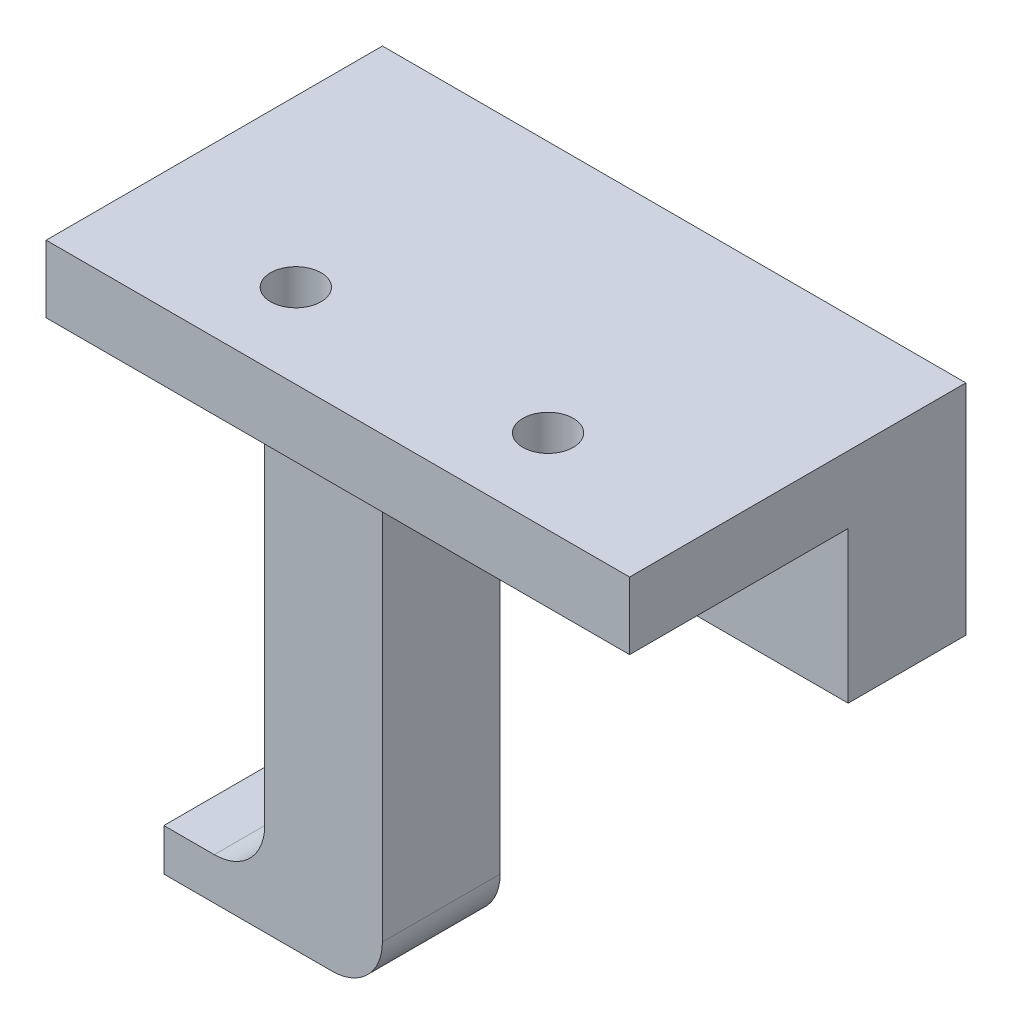
ISO-10303-21;
HEADER;
FILE_DESCRIPTION(('STEP AP214'),'2;1');
FILE_NAME('part.step','',(''),(''),'','','');
FILE_SCHEMA(('AUTOMOTIVE_DESIGN { 1 0 10303 214 1 1 1 1 }'));
ENDSEC;
DATA;
#1=APPLICATION_CONTEXT('core data for automotive mechanical design processes');
#2=APPLICATION_PROTOCOL_DEFINITION('international standard','automotive_design',2000,#1);
#3=PRODUCT_CONTEXT('',#1,'mechanical');
#4=PRODUCT('Part','Part','',(#3));
#5=PRODUCT_RELATED_PRODUCT_CATEGORY('part','',(#4));
#6=PRODUCT_DEFINITION_FORMATION('','',#4);
#7=PRODUCT_DEFINITION_CONTEXT('part definition',#1,'design');
#8=PRODUCT_DEFINITION('design','',#6,#7);
#9=PRODUCT_DEFINITION_SHAPE('','',#8);
#10=(LENGTH_UNIT() NAMED_UNIT(*) SI_UNIT(.MILLI.,.METRE.));
#11=(NAMED_UNIT(*) PLANE_ANGLE_UNIT() SI_UNIT($,.RADIAN.));
#12=(NAMED_UNIT(*) SI_UNIT($,.STERADIAN.) SOLID_ANGLE_UNIT());
#13=UNCERTAINTY_MEASURE_WITH_UNIT(LENGTH_MEASURE(1.E-05),#10,'distance_accuracy_value','');
#14=(GEOMETRIC_REPRESENTATION_CONTEXT(3) GLOBAL_UNCERTAINTY_ASSIGNED_CONTEXT((#13)) GLOBAL_UNIT_ASSIGNED_CONTEXT((#10,
#11,#12)) REPRESENTATION_CONTEXT('',''));
#15=CARTESIAN_POINT('',(0.,0.,0.));
#16=DIRECTION('',(0.,0.,1.));
#17=DIRECTION('',(1.,0.,0.));
#18=AXIS2_PLACEMENT_3D('',#15,#16,#17);
#19=CARTESIAN_POINT('',(0.,-26.65,7.));
#20=DIRECTION('',(0.,-1.,0.));
#21=DIRECTION('',(0.,0.,-1.));
#22=AXIS2_PLACEMENT_3D('',#19,#20,#21);
#23=PLANE('',#22);
#24=DIRECTION('',(-1.,0.,0.));
#25=VECTOR('',#24,1.);
#26=CARTESIAN_POINT('',(0.,-26.65,7.));
#27=LINE('',#26,#25);
#28=CARTESIAN_POINT('',(-3.,-26.65,7.));
#29=VERTEX_POINT('',#28);
#30=CARTESIAN_POINT('',(-6.,-26.65,7.));
#31=VERTEX_POINT('',#30);
#32=EDGE_CURVE('E179',#29,#31,#27,.T.);
#33=ORIENTED_EDGE('',*,*,#32,.F.);
#34=DIRECTION('',(0.,0.,-1.));
#35=VECTOR('',#34,1.);
#36=CARTESIAN_POINT('',(-3.,-26.65,0.));
#37=LINE('',#36,#35);
#38=CARTESIAN_POINT('',(-3.,-26.65,0.));
#39=VERTEX_POINT('',#38);
#40=EDGE_CURVE('E230',#29,#39,#37,.T.);
#41=ORIENTED_EDGE('',*,*,#40,.T.);
#42=DIRECTION('',(-1.,0.,0.));
#43=VECTOR('',#42,1.);
#44=CARTESIAN_POINT('',(0.,-26.65,0.));
#45=LINE('',#44,#43);
#46=CARTESIAN_POINT('',(-6.,-26.65,0.));
#47=VERTEX_POINT('',#46);
#48=EDGE_CURVE('E176',#39,#47,#45,.T.);
#49=ORIENTED_EDGE('',*,*,#48,.T.);
#50=DIRECTION('',(0.,0.,-1.));
#51=VECTOR('',#50,1.);
#52=CARTESIAN_POINT('',(-6.,-26.65,7.));
#53=LINE('',#52,#51);
#54=EDGE_CURVE('E213',#31,#47,#53,.T.);
#55=ORIENTED_EDGE('',*,*,#54,.F.);
#56=EDGE_LOOP('',(#33,#41,#49,#55));
#57=FACE_BOUND('',#56,.T.);
#58=ADVANCED_FACE('F33',(#57),#23,.F.);
#59=CARTESIAN_POINT('',(-6.,-29.15,7.));
#60=DIRECTION('',(1.,0.,0.));
#61=DIRECTION('',(0.,0.,-1.));
#62=AXIS2_PLACEMENT_3D('',#59,#60,#61);
#63=PLANE('',#62);
#64=DIRECTION('',(0.,-1.,0.));
#65=VECTOR('',#64,1.);
#66=CARTESIAN_POINT('',(-6.,-29.15,0.));
#67=LINE('',#66,#65);
#68=CARTESIAN_POINT('',(-6.,-29.15,0.));
#69=VERTEX_POINT('',#68);
#70=EDGE_CURVE('E198',#47,#69,#67,.T.);
#71=ORIENTED_EDGE('',*,*,#70,.T.);
#72=DIRECTION('',(0.,0.,-1.));
#73=VECTOR('',#72,1.);
#74=CARTESIAN_POINT('',(-6.,-29.15,7.));
#75=LINE('',#74,#73);
#76=CARTESIAN_POINT('',(-6.,-29.15,7.));
#77=VERTEX_POINT('',#76);
#78=EDGE_CURVE('E210',#77,#69,#75,.T.);
#79=ORIENTED_EDGE('',*,*,#78,.F.);
#80=DIRECTION('',(0.,-1.,0.));
#81=VECTOR('',#80,1.);
#82=CARTESIAN_POINT('',(-6.,-29.15,7.));
#83=LINE('',#82,#81);
#84=EDGE_CURVE('E181',#31,#77,#83,.T.);
#85=ORIENTED_EDGE('',*,*,#84,.F.);
#86=ORIENTED_EDGE('',*,*,#54,.T.);
#87=EDGE_LOOP('',(#71,#79,#85,#86));
#88=FACE_BOUND('',#87,.T.);
#89=ADVANCED_FACE('F251',(#88),#63,.F.);
#90=CARTESIAN_POINT('',(0.,-29.15,7.));
#91=DIRECTION('',(0.,1.,0.));
#92=DIRECTION('',(0.,0.,1.));
#93=AXIS2_PLACEMENT_3D('',#90,#91,#92);
#94=PLANE('',#93);
#95=DIRECTION('',(1.,0.,0.));
#96=VECTOR('',#95,1.);
#97=CARTESIAN_POINT('',(0.,-29.15,0.));
#98=LINE('',#97,#96);
#99=CARTESIAN_POINT('',(4.,-29.15,0.));
#100=VERTEX_POINT('',#99);
#101=EDGE_CURVE('E201',#69,#100,#98,.T.);
#102=ORIENTED_EDGE('',*,*,#101,.T.);
#103=DIRECTION('',(0.,0.,-1.));
#104=VECTOR('',#103,1.);
#105=CARTESIAN_POINT('',(4.,-29.15,7.));
#106=LINE('',#105,#104);
#107=CARTESIAN_POINT('',(4.,-29.15,7.));
#108=VERTEX_POINT('',#107);
#109=EDGE_CURVE('E226',#100,#108,#106,.F.);
#110=ORIENTED_EDGE('',*,*,#109,.T.);
#111=DIRECTION('',(1.,0.,0.));
#112=VECTOR('',#111,1.);
#113=CARTESIAN_POINT('',(0.,-29.15,7.));
#114=LINE('',#113,#112);
#115=EDGE_CURVE('E183',#77,#108,#114,.T.);
#116=ORIENTED_EDGE('',*,*,#115,.F.);
#117=ORIENTED_EDGE('',*,*,#78,.T.);
#118=EDGE_LOOP('',(#102,#110,#116,#117));
#119=FACE_BOUND('',#118,.T.);
#120=ADVANCED_FACE('F253',(#119),#94,.F.);
#121=CARTESIAN_POINT('',(7.,0.,7.));
#122=DIRECTION('',(-1.,0.,0.));
#123=DIRECTION('',(0.,-1.,0.));
#124=AXIS2_PLACEMENT_3D('',#121,#122,#123);
#125=PLANE('',#124);
#126=DIRECTION('',(0.,1.,0.));
#127=VECTOR('',#126,1.);
#128=CARTESIAN_POINT('',(7.,0.,0.));
#129=LINE('',#128,#127);
#130=CARTESIAN_POINT('',(7.,-26.15,0.));
#131=VERTEX_POINT('',#130);
#132=CARTESIAN_POINT('',(7.,-3.,0.));
#133=VERTEX_POINT('',#132);
#134=EDGE_CURVE('E204',#131,#133,#129,.T.);
#135=ORIENTED_EDGE('',*,*,#134,.T.);
#136=DIRECTION('',(0.,0.,-1.));
#137=VECTOR('',#136,1.);
#138=CARTESIAN_POINT('',(7.,-3.,7.));
#139=LINE('',#138,#137);
#140=CARTESIAN_POINT('',(7.,-3.,7.));
#141=VERTEX_POINT('',#140);
#142=EDGE_CURVE('E222',#133,#141,#139,.F.);
#143=ORIENTED_EDGE('',*,*,#142,.T.);
#144=DIRECTION('',(0.,1.,0.));
#145=VECTOR('',#144,1.);
#146=CARTESIAN_POINT('',(7.,0.,7.));
#147=LINE('',#146,#145);
#148=CARTESIAN_POINT('',(7.,-26.15,7.));
#149=VERTEX_POINT('',#148);
#150=EDGE_CURVE('E186',#149,#141,#147,.T.);
#151=ORIENTED_EDGE('',*,*,#150,.F.);
#152=DIRECTION('',(0.,0.,-1.));
#153=VECTOR('',#152,1.);
#154=CARTESIAN_POINT('',(7.,-26.15,7.));
#155=LINE('',#154,#153);
#156=EDGE_CURVE('E219',#149,#131,#155,.T.);
#157=ORIENTED_EDGE('',*,*,#156,.T.);
#158=EDGE_LOOP('',(#135,#143,#151,#157));
#159=FACE_BOUND('',#158,.T.);
#160=ADVANCED_FACE('F261',(#159),#125,.F.);
#161=CARTESIAN_POINT('',(7.,0.,7.));
#162=DIRECTION('',(0.,1.,0.));
#163=DIRECTION('',(0.,0.,1.));
#164=AXIS2_PLACEMENT_3D('',#161,#162,#163);
#165=PLANE('',#164);
#166=DIRECTION('',(1.,0.,0.));
#167=VECTOR('',#166,1.);
#168=CARTESIAN_POINT('',(7.,0.,7.));
#169=LINE('',#168,#167);
#170=CARTESIAN_POINT('',(10.,0.,7.));
#171=VERTEX_POINT('',#170);
#172=CARTESIAN_POINT('',(34.7,0.,7.));
#173=VERTEX_POINT('',#172);
#174=EDGE_CURVE('E189',#171,#173,#169,.T.);
#175=ORIENTED_EDGE('',*,*,#174,.F.);
#176=DIRECTION('',(0.,0.,-1.));
#177=VECTOR('',#176,1.);
#178=CARTESIAN_POINT('',(10.,0.,0.));
#179=LINE('',#178,#177);
#180=CARTESIAN_POINT('',(10.,0.,0.));
#181=VERTEX_POINT('',#180);
#182=EDGE_CURVE('E216',#171,#181,#179,.T.);
#183=ORIENTED_EDGE('',*,*,#182,.T.);
#184=DIRECTION('',(1.,0.,0.));
#185=VECTOR('',#184,1.);
#186=CARTESIAN_POINT('',(7.,0.,0.));
#187=LINE('',#186,#185);
#188=CARTESIAN_POINT('',(34.7,0.,0.));
#189=VERTEX_POINT('',#188);
#190=EDGE_CURVE('E141',#181,#189,#187,.T.);
#191=ORIENTED_EDGE('',*,*,#190,.T.);
#192=DIRECTION('',(0.,0.,-1.));
#193=VECTOR('',#192,1.);
#194=CARTESIAN_POINT('',(34.7,0.,7.));
#195=LINE('',#194,#193);
#196=EDGE_CURVE('E137',#173,#189,#195,.T.);
#197=ORIENTED_EDGE('',*,*,#196,.F.);
#198=EDGE_LOOP('',(#175,#183,#191,#197));
#199=FACE_BOUND('',#198,.T.);
#200=ADVANCED_FACE('F268',(#199),#165,.F.);
#201=CARTESIAN_POINT('',(34.7,0.,7.));
#202=DIRECTION('',(-1.,0.,0.));
#203=DIRECTION('',(0.,0.,1.));
#204=AXIS2_PLACEMENT_3D('',#201,#202,#203);
#205=PLANE('',#204);
#206=DIRECTION('',(0.,1.,0.));
#207=VECTOR('',#206,1.);
#208=CARTESIAN_POINT('',(34.7,0.,0.));
#209=LINE('',#208,#207);
#210=CARTESIAN_POINT('',(34.7,13.,0.));
#211=VERTEX_POINT('',#210);
#212=EDGE_CURVE('E129',#189,#211,#209,.T.);
#213=ORIENTED_EDGE('',*,*,#212,.T.);
#214=DIRECTION('',(0.,0.,-1.));
#215=VECTOR('',#214,1.);
#216=CARTESIAN_POINT('',(34.7,13.,0.));
#217=LINE('',#216,#215);
#218=CARTESIAN_POINT('',(34.7,13.,20.));
#219=VERTEX_POINT('',#218);
#220=EDGE_CURVE('E134',#219,#211,#217,.T.);
#221=ORIENTED_EDGE('',*,*,#220,.F.);
#222=DIRECTION('',(0.,-1.,0.));
#223=VECTOR('',#222,1.);
#224=CARTESIAN_POINT('',(34.7,13.,20.));
#225=LINE('',#224,#223);
#226=CARTESIAN_POINT('',(34.7,9.,20.));
#227=VERTEX_POINT('',#226);
#228=EDGE_CURVE('E166',#219,#227,#225,.T.);
#229=ORIENTED_EDGE('',*,*,#228,.T.);
#230=DIRECTION('',(0.,0.,-1.));
#231=VECTOR('',#230,1.);
#232=CARTESIAN_POINT('',(34.7,9.,0.));
#233=LINE('',#232,#231);
#234=CARTESIAN_POINT('',(34.7,9.,7.));
#235=VERTEX_POINT('',#234);
#236=EDGE_CURVE('E167',#227,#235,#233,.T.);
#237=ORIENTED_EDGE('',*,*,#236,.T.);
#238=DIRECTION('',(0.,1.,0.));
#239=VECTOR('',#238,1.);
#240=CARTESIAN_POINT('',(34.7,0.,7.));
#241=LINE('',#240,#239);
#242=EDGE_CURVE('E191',#173,#235,#241,.T.);
#243=ORIENTED_EDGE('',*,*,#242,.F.);
#244=ORIENTED_EDGE('',*,*,#196,.T.);
#245=EDGE_LOOP('',(#213,#221,#229,#237,#243,#244));
#246=FACE_BOUND('',#245,.T.);
#247=ADVANCED_FACE('F131',(#246),#205,.F.);
#248=CARTESIAN_POINT('',(0.,0.,7.));
#249=DIRECTION('',(1.,0.,0.));
#250=DIRECTION('',(0.,0.,-1.));
#251=AXIS2_PLACEMENT_3D('',#248,#249,#250);
#252=PLANE('',#251);
#253=DIRECTION('',(0.,-1.,0.));
#254=VECTOR('',#253,1.);
#255=CARTESIAN_POINT('',(0.,0.,0.));
#256=LINE('',#255,#254);
#257=CARTESIAN_POINT('',(0.,13.,0.));
#258=VERTEX_POINT('',#257);
#259=CARTESIAN_POINT('',(0.,-23.65,0.));
#260=VERTEX_POINT('',#259);
#261=EDGE_CURVE('E140',#258,#260,#256,.T.);
#262=ORIENTED_EDGE('',*,*,#261,.T.);
#263=DIRECTION('',(0.,0.,-1.));
#264=VECTOR('',#263,1.);
#265=CARTESIAN_POINT('',(0.,-23.65,7.));
#266=LINE('',#265,#264);
#267=CARTESIAN_POINT('',(0.,-23.65,7.));
#268=VERTEX_POINT('',#267);
#269=EDGE_CURVE('E54',#260,#268,#266,.F.);
#270=ORIENTED_EDGE('',*,*,#269,.T.);
#271=DIRECTION('',(0.,-1.,0.));
#272=VECTOR('',#271,1.);
#273=CARTESIAN_POINT('',(0.,0.,7.));
#274=LINE('',#273,#272);
#275=CARTESIAN_POINT('',(0.,9.,7.));
#276=VERTEX_POINT('',#275);
#277=EDGE_CURVE('E177',#276,#268,#274,.T.);
#278=ORIENTED_EDGE('',*,*,#277,.F.);
#279=DIRECTION('',(0.,0.,1.));
#280=VECTOR('',#279,1.);
#281=CARTESIAN_POINT('',(0.,9.,0.));
#282=LINE('',#281,#280);
#283=CARTESIAN_POINT('',(0.,9.,20.));
#284=VERTEX_POINT('',#283);
#285=EDGE_CURVE('E158',#276,#284,#282,.T.);
#286=ORIENTED_EDGE('',*,*,#285,.T.);
#287=DIRECTION('',(0.,-1.,0.));
#288=VECTOR('',#287,1.);
#289=CARTESIAN_POINT('',(0.,13.,20.));
#290=LINE('',#289,#288);
#291=CARTESIAN_POINT('',(0.,13.,20.));
#292=VERTEX_POINT('',#291);
#293=EDGE_CURVE('E173',#292,#284,#290,.T.);
#294=ORIENTED_EDGE('',*,*,#293,.F.);
#295=DIRECTION('',(0.,0.,1.));
#296=VECTOR('',#295,1.);
#297=CARTESIAN_POINT('',(0.,13.,0.));
#298=LINE('',#297,#296);
#299=EDGE_CURVE('E149',#258,#292,#298,.T.);
#300=ORIENTED_EDGE('',*,*,#299,.F.);
#301=EDGE_LOOP('',(#262,#270,#278,#286,#294,#300));
#302=FACE_BOUND('',#301,.T.);
#303=ADVANCED_FACE('F241',(#302),#252,.F.);
#304=CARTESIAN_POINT('',(0.,0.,7.));
#305=DIRECTION('',(0.,0.,-1.));
#306=DIRECTION('',(-1.,0.,0.));
#307=AXIS2_PLACEMENT_3D('',#304,#305,#306);
#308=PLANE('',#307);
#309=ORIENTED_EDGE('',*,*,#115,.T.);
#310=CARTESIAN_POINT('',(4.,-26.15,7.));
#311=DIRECTION('',(0.,0.,-1.));
#312=DIRECTION('',(-1.,0.,0.));
#313=AXIS2_PLACEMENT_3D('',#310,#311,#312);
#314=CIRCLE('',#313,3.);
#315=EDGE_CURVE('E228',#108,#149,#314,.F.);
#316=ORIENTED_EDGE('',*,*,#315,.T.);
#317=ORIENTED_EDGE('',*,*,#150,.T.);
#318=CARTESIAN_POINT('',(10.,-3.,7.));
#319=DIRECTION('',(0.,0.,-1.));
#320=DIRECTION('',(-1.,0.,0.));
#321=AXIS2_PLACEMENT_3D('',#318,#319,#320);
#322=CIRCLE('',#321,3.);
#323=EDGE_CURVE('E236',#141,#171,#322,.T.);
#324=ORIENTED_EDGE('',*,*,#323,.T.);
#325=ORIENTED_EDGE('',*,*,#174,.T.);
#326=ORIENTED_EDGE('',*,*,#242,.T.);
#327=DIRECTION('',(-1.,0.,0.));
#328=VECTOR('',#327,1.);
#329=CARTESIAN_POINT('',(0.,9.,7.));
#330=LINE('',#329,#328);
#331=EDGE_CURVE('E194',#235,#276,#330,.T.);
#332=ORIENTED_EDGE('',*,*,#331,.T.);
#333=ORIENTED_EDGE('',*,*,#277,.T.);
#334=CARTESIAN_POINT('',(-3.,-23.65,7.));
#335=DIRECTION('',(0.,0.,-1.));
#336=DIRECTION('',(-1.,0.,0.));
#337=AXIS2_PLACEMENT_3D('',#334,#335,#336);
#338=CIRCLE('',#337,3.);
#339=EDGE_CURVE('E11',#268,#29,#338,.T.);
#340=ORIENTED_EDGE('',*,*,#339,.T.);
#341=ORIENTED_EDGE('',*,*,#32,.T.);
#342=ORIENTED_EDGE('',*,*,#84,.T.);
#343=EDGE_LOOP('',(#309,#316,#317,#324,#325,#326,#332,#333,#340,#341,#342));
#344=FACE_BOUND('',#343,.T.);
#345=ADVANCED_FACE('F246',(#344),#308,.F.);
#346=CARTESIAN_POINT('',(0.,0.,0.));
#347=DIRECTION('',(0.,0.,-1.));
#348=DIRECTION('',(-1.,0.,0.));
#349=AXIS2_PLACEMENT_3D('',#346,#347,#348);
#350=PLANE('',#349);
#351=ORIENTED_EDGE('',*,*,#134,.F.);
#352=CARTESIAN_POINT('',(4.,-26.15,0.));
#353=DIRECTION('',(0.,0.,-1.));
#354=DIRECTION('',(-1.,0.,0.));
#355=AXIS2_PLACEMENT_3D('',#352,#353,#354);
#356=CIRCLE('',#355,3.);
#357=EDGE_CURVE('E224',#131,#100,#356,.T.);
#358=ORIENTED_EDGE('',*,*,#357,.T.);
#359=ORIENTED_EDGE('',*,*,#101,.F.);
#360=ORIENTED_EDGE('',*,*,#70,.F.);
#361=ORIENTED_EDGE('',*,*,#48,.F.);
#362=CARTESIAN_POINT('',(-3.,-23.65,0.));
#363=DIRECTION('',(0.,0.,-1.));
#364=DIRECTION('',(-1.,0.,0.));
#365=AXIS2_PLACEMENT_3D('',#362,#363,#364);
#366=CIRCLE('',#365,3.);
#367=EDGE_CURVE('E41',#39,#260,#366,.F.);
#368=ORIENTED_EDGE('',*,*,#367,.T.);
#369=ORIENTED_EDGE('',*,*,#261,.F.);
#370=DIRECTION('',(-1.,0.,0.));
#371=VECTOR('',#370,1.);
#372=CARTESIAN_POINT('',(34.7,13.,0.));
#373=LINE('',#372,#371);
#374=EDGE_CURVE('E144',#211,#258,#373,.T.);
#375=ORIENTED_EDGE('',*,*,#374,.F.);
#376=ORIENTED_EDGE('',*,*,#212,.F.);
#377=ORIENTED_EDGE('',*,*,#190,.F.);
#378=CARTESIAN_POINT('',(10.,-3.,0.));
#379=DIRECTION('',(0.,0.,-1.));
#380=DIRECTION('',(-1.,0.,0.));
#381=AXIS2_PLACEMENT_3D('',#378,#379,#380);
#382=CIRCLE('',#381,3.);
#383=EDGE_CURVE('E234',#181,#133,#382,.F.);
#384=ORIENTED_EDGE('',*,*,#383,.T.);
#385=EDGE_LOOP('',(#351,#358,#359,#360,#361,#368,#369,#375,#376,#377,#384));
#386=FACE_BOUND('',#385,.T.);
#387=ADVANCED_FACE('F146',(#386),#350,.T.);
#388=CARTESIAN_POINT('',(10.,-3.,7.));
#389=DIRECTION('',(0.,0.,1.));
#390=DIRECTION('',(1.,0.,0.));
#391=AXIS2_PLACEMENT_3D('',#388,#389,#390);
#392=CYLINDRICAL_SURFACE('',#391,3.);
#393=ORIENTED_EDGE('',*,*,#323,.F.);
#394=ORIENTED_EDGE('',*,*,#142,.F.);
#395=ORIENTED_EDGE('',*,*,#383,.F.);
#396=ORIENTED_EDGE('',*,*,#182,.F.);
#397=EDGE_LOOP('',(#393,#394,#395,#396));
#398=FACE_BOUND('',#397,.T.);
#399=ADVANCED_FACE('F264',(#398),#392,.F.);
#400=CARTESIAN_POINT('',(4.,-26.15,7.));
#401=DIRECTION('',(0.,0.,-1.));
#402=DIRECTION('',(-1.,0.,0.));
#403=AXIS2_PLACEMENT_3D('',#400,#401,#402);
#404=CYLINDRICAL_SURFACE('',#403,3.);
#405=ORIENTED_EDGE('',*,*,#315,.F.);
#406=ORIENTED_EDGE('',*,*,#109,.F.);
#407=ORIENTED_EDGE('',*,*,#357,.F.);
#408=ORIENTED_EDGE('',*,*,#156,.F.);
#409=EDGE_LOOP('',(#405,#406,#407,#408));
#410=FACE_BOUND('',#409,.T.);
#411=ADVANCED_FACE('F256',(#410),#404,.T.);
#412=CARTESIAN_POINT('',(-3.,-23.65,7.));
#413=DIRECTION('',(0.,0.,1.));
#414=DIRECTION('',(1.,0.,0.));
#415=AXIS2_PLACEMENT_3D('',#412,#413,#414);
#416=CYLINDRICAL_SURFACE('',#415,3.);
#417=ORIENTED_EDGE('',*,*,#339,.F.);
#418=ORIENTED_EDGE('',*,*,#269,.F.);
#419=ORIENTED_EDGE('',*,*,#367,.F.);
#420=ORIENTED_EDGE('',*,*,#40,.F.);
#421=EDGE_LOOP('',(#417,#418,#419,#420));
#422=FACE_BOUND('',#421,.T.);
#423=ADVANCED_FACE('F35',(#422),#416,.F.);
#424=CARTESIAN_POINT('',(0.,9.,0.));
#425=DIRECTION('',(0.,-1.,0.));
#426=DIRECTION('',(0.,0.,-1.));
#427=AXIS2_PLACEMENT_3D('',#424,#425,#426);
#428=PLANE('',#427);
#429=CARTESIAN_POINT('',(9.84999999999955,9.,15.));
#430=DIRECTION('',(0.,1.,0.));
#431=DIRECTION('',(0.,0.,1.));
#432=AXIS2_PLACEMENT_3D('',#429,#430,#431);
#433=CIRCLE('',#432,1.5);
#434=CARTESIAN_POINT('',(9.84999999999955,9.,16.5));
#435=VERTEX_POINT('',#434);
#436=EDGE_CURVE('E319',#435,#435,#433,.T.);
#437=ORIENTED_EDGE('',*,*,#436,.T.);
#438=EDGE_LOOP('',(#437));
#439=FACE_BOUND('',#438,.T.);
#440=CARTESIAN_POINT('',(24.8499999999956,9.,15.));
#441=DIRECTION('',(0.,1.,0.));
#442=DIRECTION('',(0.,0.,1.));
#443=AXIS2_PLACEMENT_3D('',#440,#441,#442);
#444=CIRCLE('',#443,1.5);
#445=CARTESIAN_POINT('',(24.8499999999956,9.,16.5));
#446=VERTEX_POINT('',#445);
#447=EDGE_CURVE('E161',#446,#446,#444,.T.);
#448=ORIENTED_EDGE('',*,*,#447,.T.);
#449=EDGE_LOOP('',(#448));
#450=FACE_BOUND('',#449,.T.);
#451=ORIENTED_EDGE('',*,*,#331,.F.);
#452=ORIENTED_EDGE('',*,*,#236,.F.);
#453=DIRECTION('',(1.,0.,0.));
#454=VECTOR('',#453,1.);
#455=CARTESIAN_POINT('',(34.7,9.,20.));
#456=LINE('',#455,#454);
#457=EDGE_CURVE('E156',#284,#227,#456,.T.);
#458=ORIENTED_EDGE('',*,*,#457,.F.);
#459=ORIENTED_EDGE('',*,*,#285,.F.);
#460=EDGE_LOOP('',(#451,#452,#458,#459));
#461=FACE_BOUND('',#460,.T.);
#462=ADVANCED_FACE('F271',(#439,#450,#461),#428,.T.);
#463=CARTESIAN_POINT('',(0.,13.,0.));
#464=DIRECTION('',(0.,-1.,0.));
#465=DIRECTION('',(0.,0.,-1.));
#466=AXIS2_PLACEMENT_3D('',#463,#464,#465);
#467=PLANE('',#466);
#468=ORIENTED_EDGE('',*,*,#220,.T.);
#469=ORIENTED_EDGE('',*,*,#374,.T.);
#470=ORIENTED_EDGE('',*,*,#299,.T.);
#471=DIRECTION('',(1.,0.,0.));
#472=VECTOR('',#471,1.);
#473=CARTESIAN_POINT('',(34.7,13.,20.));
#474=LINE('',#473,#472);
#475=EDGE_CURVE('E154',#292,#219,#474,.T.);
#476=ORIENTED_EDGE('',*,*,#475,.T.);
#477=EDGE_LOOP('',(#468,#469,#470,#476));
#478=FACE_BOUND('',#477,.T.);
#479=CARTESIAN_POINT('',(24.8499999999956,13.,15.));
#480=DIRECTION('',(0.,1.,0.));
#481=DIRECTION('',(0.,0.,1.));
#482=AXIS2_PLACEMENT_3D('',#479,#480,#481);
#483=CIRCLE('',#482,1.5);
#484=CARTESIAN_POINT('',(24.8499999999956,13.,16.5));
#485=VERTEX_POINT('',#484);
#486=EDGE_CURVE('E170',#485,#485,#483,.T.);
#487=ORIENTED_EDGE('',*,*,#486,.F.);
#488=EDGE_LOOP('',(#487));
#489=FACE_BOUND('',#488,.T.);
#490=CARTESIAN_POINT('',(9.84999999999955,13.,15.));
#491=DIRECTION('',(0.,1.,0.));
#492=DIRECTION('',(0.,0.,1.));
#493=AXIS2_PLACEMENT_3D('',#490,#491,#492);
#494=CIRCLE('',#493,1.5);
#495=CARTESIAN_POINT('',(9.84999999999955,13.,16.5));
#496=VERTEX_POINT('',#495);
#497=EDGE_CURVE('E317',#496,#496,#494,.T.);
#498=ORIENTED_EDGE('',*,*,#497,.F.);
#499=EDGE_LOOP('',(#498));
#500=FACE_BOUND('',#499,.T.);
#501=ADVANCED_FACE('F151',(#478,#489,#500),#467,.F.);
#502=CARTESIAN_POINT('',(34.7,13.,20.));
#503=DIRECTION('',(0.,0.,-1.));
#504=DIRECTION('',(-1.,0.,0.));
#505=AXIS2_PLACEMENT_3D('',#502,#503,#504);
#506=PLANE('',#505);
#507=ORIENTED_EDGE('',*,*,#457,.T.);
#508=ORIENTED_EDGE('',*,*,#228,.F.);
#509=ORIENTED_EDGE('',*,*,#475,.F.);
#510=ORIENTED_EDGE('',*,*,#293,.T.);
#511=EDGE_LOOP('',(#507,#508,#509,#510));
#512=FACE_BOUND('',#511,.T.);
#513=ADVANCED_FACE('F274',(#512),#506,.F.);
#514=CARTESIAN_POINT('',(24.8499999999956,13.,15.));
#515=DIRECTION('',(0.,-1.,0.));
#516=DIRECTION('',(0.,0.,-1.));
#517=AXIS2_PLACEMENT_3D('',#514,#515,#516);
#518=CYLINDRICAL_SURFACE('',#517,1.5);
#519=ORIENTED_EDGE('',*,*,#486,.T.);
#520=EDGE_LOOP('',(#519));
#521=FACE_BOUND('',#520,.T.);
#522=ORIENTED_EDGE('',*,*,#447,.F.);
#523=EDGE_LOOP('',(#522));
#524=FACE_BOUND('',#523,.T.);
#525=ADVANCED_FACE('F276',(#521,#524),#518,.F.);
#526=CARTESIAN_POINT('',(9.84999999999955,13.,15.));
#527=DIRECTION('',(0.,-1.,0.));
#528=DIRECTION('',(0.,0.,-1.));
#529=AXIS2_PLACEMENT_3D('',#526,#527,#528);
#530=CYLINDRICAL_SURFACE('',#529,1.5);
#531=ORIENTED_EDGE('',*,*,#497,.T.);
#532=EDGE_LOOP('',(#531));
#533=FACE_BOUND('',#532,.T.);
#534=ORIENTED_EDGE('',*,*,#436,.F.);
#535=EDGE_LOOP('',(#534));
#536=FACE_BOUND('',#535,.T.);
#537=ADVANCED_FACE('F282',(#533,#536),#530,.F.);
#538=CLOSED_SHELL('',(#58,#89,#120,#160,#200,#247,#303,#345,#387,#399,#411,#423,#462,#501,#513,
#525,#537));
#539=MANIFOLD_SOLID_BREP('B2',#538);
#540=ADVANCED_BREP_SHAPE_REPRESENTATION('',(#18,#539),#14);
#541=SHAPE_DEFINITION_REPRESENTATION(#9,#540);
ENDSEC;
END-ISO-10303-21;
